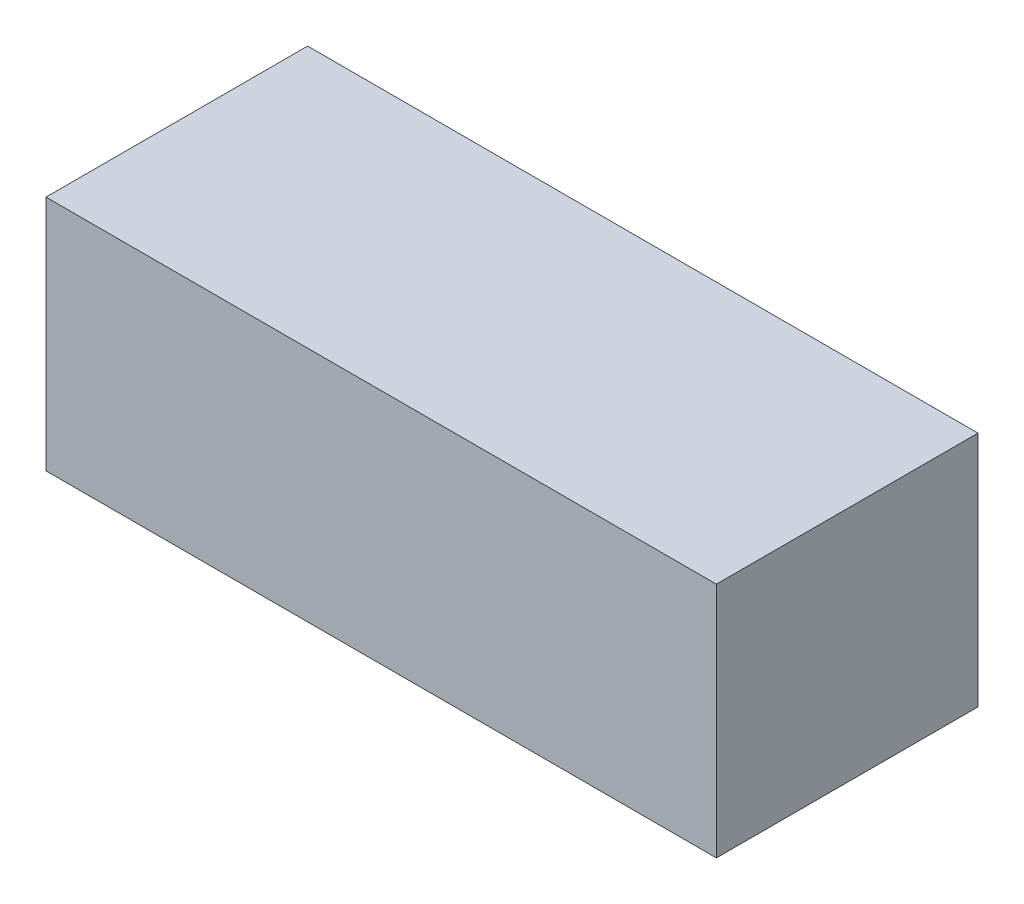
ISO-10303-21;
HEADER;
FILE_DESCRIPTION(('STEP AP214'),'2;1');
FILE_NAME('part.step','',(''),(''),'','','');
FILE_SCHEMA(('AUTOMOTIVE_DESIGN { 1 0 10303 214 1 1 1 1 }'));
ENDSEC;
DATA;
#1=APPLICATION_CONTEXT('core data for automotive mechanical design processes');
#2=APPLICATION_PROTOCOL_DEFINITION('international standard','automotive_design',2000,#1);
#3=PRODUCT_CONTEXT('',#1,'mechanical');
#4=PRODUCT('Part','Part','',(#3));
#5=PRODUCT_RELATED_PRODUCT_CATEGORY('part','',(#4));
#6=PRODUCT_DEFINITION_FORMATION('','',#4);
#7=PRODUCT_DEFINITION_CONTEXT('part definition',#1,'design');
#8=PRODUCT_DEFINITION('design','',#6,#7);
#9=PRODUCT_DEFINITION_SHAPE('','',#8);
#10=(LENGTH_UNIT() NAMED_UNIT(*) SI_UNIT(.MILLI.,.METRE.));
#11=(NAMED_UNIT(*) PLANE_ANGLE_UNIT() SI_UNIT($,.RADIAN.));
#12=(NAMED_UNIT(*) SI_UNIT($,.STERADIAN.) SOLID_ANGLE_UNIT());
#13=UNCERTAINTY_MEASURE_WITH_UNIT(LENGTH_MEASURE(1.E-05),#10,'distance_accuracy_value','');
#14=(GEOMETRIC_REPRESENTATION_CONTEXT(3) GLOBAL_UNCERTAINTY_ASSIGNED_CONTEXT((#13)) GLOBAL_UNIT_ASSIGNED_CONTEXT((#10,
#11,#12)) REPRESENTATION_CONTEXT('',''));
#15=CARTESIAN_POINT('',(0.,0.,0.));
#16=DIRECTION('',(0.,0.,1.));
#17=DIRECTION('',(1.,0.,0.));
#18=AXIS2_PLACEMENT_3D('',#15,#16,#17);
#19=CARTESIAN_POINT('',(155.,72.5000000000001,-519.885042281291));
#20=DIRECTION('',(1.,0.,0.));
#21=DIRECTION('',(0.,0.,-1.));
#22=AXIS2_PLACEMENT_3D('',#19,#20,#21);
#23=PLANE('',#22);
#24=DIRECTION('',(0.,-1.,0.));
#25=VECTOR('',#24,1.);
#26=CARTESIAN_POINT('',(155.,72.5000000000001,-80.));
#27=LINE('',#26,#25);
#28=CARTESIAN_POINT('',(155.,72.5000000000001,-80.));
#29=VERTEX_POINT('',#28);
#30=CARTESIAN_POINT('',(155.,-72.5,-80.));
#31=VERTEX_POINT('',#30);
#32=EDGE_CURVE('E41',#29,#31,#27,.T.);
#33=ORIENTED_EDGE('',*,*,#32,.F.);
#34=DIRECTION('',(0.,0.,1.));
#35=VECTOR('',#34,1.);
#36=CARTESIAN_POINT('',(155.,72.5000000000001,-519.885042281291));
#37=LINE('',#36,#35);
#38=CARTESIAN_POINT('',(155.,72.5000000000001,80.));
#39=VERTEX_POINT('',#38);
#40=EDGE_CURVE('E100',#29,#39,#37,.T.);
#41=ORIENTED_EDGE('',*,*,#40,.T.);
#42=DIRECTION('',(0.,-1.,0.));
#43=VECTOR('',#42,1.);
#44=CARTESIAN_POINT('',(155.,72.5,80.));
#45=LINE('',#44,#43);
#46=CARTESIAN_POINT('',(155.,-72.5,80.));
#47=VERTEX_POINT('',#46);
#48=EDGE_CURVE('E94',#39,#47,#45,.T.);
#49=ORIENTED_EDGE('',*,*,#48,.T.);
#50=DIRECTION('',(0.,0.,1.));
#51=VECTOR('',#50,1.);
#52=CARTESIAN_POINT('',(155.,-72.5,-519.885042281291));
#53=LINE('',#52,#51);
#54=EDGE_CURVE('E76',#31,#47,#53,.T.);
#55=ORIENTED_EDGE('',*,*,#54,.F.);
#56=EDGE_LOOP('',(#33,#41,#49,#55));
#57=FACE_BOUND('',#56,.T.);
#58=ADVANCED_FACE('F33',(#57),#23,.T.);
#59=CARTESIAN_POINT('',(155.,-72.5,-519.885042281291));
#60=DIRECTION('',(0.,-1.,0.));
#61=DIRECTION('',(1.,0.,0.));
#62=AXIS2_PLACEMENT_3D('',#59,#60,#61);
#63=PLANE('',#62);
#64=DIRECTION('',(-1.,0.,0.));
#65=VECTOR('',#64,1.);
#66=CARTESIAN_POINT('',(155.,-72.5,-80.));
#67=LINE('',#66,#65);
#68=CARTESIAN_POINT('',(-255.,-72.5,-80.));
#69=VERTEX_POINT('',#68);
#70=EDGE_CURVE('E47',#31,#69,#67,.T.);
#71=ORIENTED_EDGE('',*,*,#70,.F.);
#72=ORIENTED_EDGE('',*,*,#54,.T.);
#73=DIRECTION('',(-1.,0.,0.));
#74=VECTOR('',#73,1.);
#75=CARTESIAN_POINT('',(155.,-72.5,80.));
#76=LINE('',#75,#74);
#77=CARTESIAN_POINT('',(-255.,-72.5,80.));
#78=VERTEX_POINT('',#77);
#79=EDGE_CURVE('E84',#47,#78,#76,.T.);
#80=ORIENTED_EDGE('',*,*,#79,.T.);
#81=DIRECTION('',(0.,0.,1.));
#82=VECTOR('',#81,1.);
#83=CARTESIAN_POINT('',(-255.,-72.5,-519.885042281291));
#84=LINE('',#83,#82);
#85=EDGE_CURVE('E68',#69,#78,#84,.T.);
#86=ORIENTED_EDGE('',*,*,#85,.F.);
#87=EDGE_LOOP('',(#71,#72,#80,#86));
#88=FACE_BOUND('',#87,.T.);
#89=ADVANCED_FACE('F89',(#88),#63,.T.);
#90=CARTESIAN_POINT('',(-255.,72.5,-519.885042281291));
#91=DIRECTION('',(-1.,0.,0.));
#92=DIRECTION('',(0.,0.,1.));
#93=AXIS2_PLACEMENT_3D('',#90,#91,#92);
#94=PLANE('',#93);
#95=DIRECTION('',(0.,1.,0.));
#96=VECTOR('',#95,1.);
#97=CARTESIAN_POINT('',(-255.,72.5000000000001,-80.));
#98=LINE('',#97,#96);
#99=CARTESIAN_POINT('',(-255.,72.5,-80.));
#100=VERTEX_POINT('',#99);
#101=EDGE_CURVE('E73',#69,#100,#98,.T.);
#102=ORIENTED_EDGE('',*,*,#101,.F.);
#103=ORIENTED_EDGE('',*,*,#85,.T.);
#104=DIRECTION('',(0.,1.,0.));
#105=VECTOR('',#104,1.);
#106=CARTESIAN_POINT('',(-255.,72.4999999999999,80.));
#107=LINE('',#106,#105);
#108=CARTESIAN_POINT('',(-255.,72.5,80.));
#109=VERTEX_POINT('',#108);
#110=EDGE_CURVE('E72',#78,#109,#107,.T.);
#111=ORIENTED_EDGE('',*,*,#110,.T.);
#112=DIRECTION('',(0.,0.,1.));
#113=VECTOR('',#112,1.);
#114=CARTESIAN_POINT('',(-255.,72.5,-519.885042281291));
#115=LINE('',#114,#113);
#116=EDGE_CURVE('E77',#100,#109,#115,.T.);
#117=ORIENTED_EDGE('',*,*,#116,.F.);
#118=EDGE_LOOP('',(#102,#103,#111,#117));
#119=FACE_BOUND('',#118,.T.);
#120=ADVANCED_FACE('F70',(#119),#94,.T.);
#121=CARTESIAN_POINT('',(155.,72.5000000000001,-519.885042281291));
#122=DIRECTION('',(0.,1.,0.));
#123=DIRECTION('',(-1.,0.,0.));
#124=AXIS2_PLACEMENT_3D('',#121,#122,#123);
#125=PLANE('',#124);
#126=DIRECTION('',(1.,0.,0.));
#127=VECTOR('',#126,1.);
#128=CARTESIAN_POINT('',(155.,72.5000000000001,-80.));
#129=LINE('',#128,#127);
#130=EDGE_CURVE('E11',#100,#29,#129,.T.);
#131=ORIENTED_EDGE('',*,*,#130,.F.);
#132=ORIENTED_EDGE('',*,*,#116,.T.);
#133=DIRECTION('',(1.,0.,0.));
#134=VECTOR('',#133,1.);
#135=CARTESIAN_POINT('',(155.,72.5000000000001,80.));
#136=LINE('',#135,#134);
#137=EDGE_CURVE('E87',#109,#39,#136,.T.);
#138=ORIENTED_EDGE('',*,*,#137,.T.);
#139=ORIENTED_EDGE('',*,*,#40,.F.);
#140=EDGE_LOOP('',(#131,#132,#138,#139));
#141=FACE_BOUND('',#140,.T.);
#142=ADVANCED_FACE('F106',(#141),#125,.T.);
#143=CARTESIAN_POINT('',(-150.,-62.5,-80.));
#144=DIRECTION('',(0.,0.,1.));
#145=DIRECTION('',(-1.,0.,0.));
#146=AXIS2_PLACEMENT_3D('',#143,#144,#145);
#147=PLANE('',#146);
#148=ORIENTED_EDGE('',*,*,#32,.T.);
#149=ORIENTED_EDGE('',*,*,#70,.T.);
#150=ORIENTED_EDGE('',*,*,#101,.T.);
#151=ORIENTED_EDGE('',*,*,#130,.T.);
#152=EDGE_LOOP('',(#148,#149,#150,#151));
#153=FACE_BOUND('',#152,.T.);
#154=ADVANCED_FACE('F107',(#153),#147,.F.);
#155=CARTESIAN_POINT('',(-150.,-62.5,80.));
#156=DIRECTION('',(0.,0.,-1.));
#157=DIRECTION('',(1.,0.,0.));
#158=AXIS2_PLACEMENT_3D('',#155,#156,#157);
#159=PLANE('',#158);
#160=ORIENTED_EDGE('',*,*,#137,.F.);
#161=ORIENTED_EDGE('',*,*,#110,.F.);
#162=ORIENTED_EDGE('',*,*,#79,.F.);
#163=ORIENTED_EDGE('',*,*,#48,.F.);
#164=EDGE_LOOP('',(#160,#161,#162,#163));
#165=FACE_BOUND('',#164,.T.);
#166=ADVANCED_FACE('F82',(#165),#159,.F.);
#167=CLOSED_SHELL('',(#58,#89,#120,#142,#154,#166));
#168=MANIFOLD_SOLID_BREP('B2',#167);
#169=ADVANCED_BREP_SHAPE_REPRESENTATION('',(#18,#168),#14);
#170=SHAPE_DEFINITION_REPRESENTATION(#9,#169);
ENDSEC;
END-ISO-10303-21;
